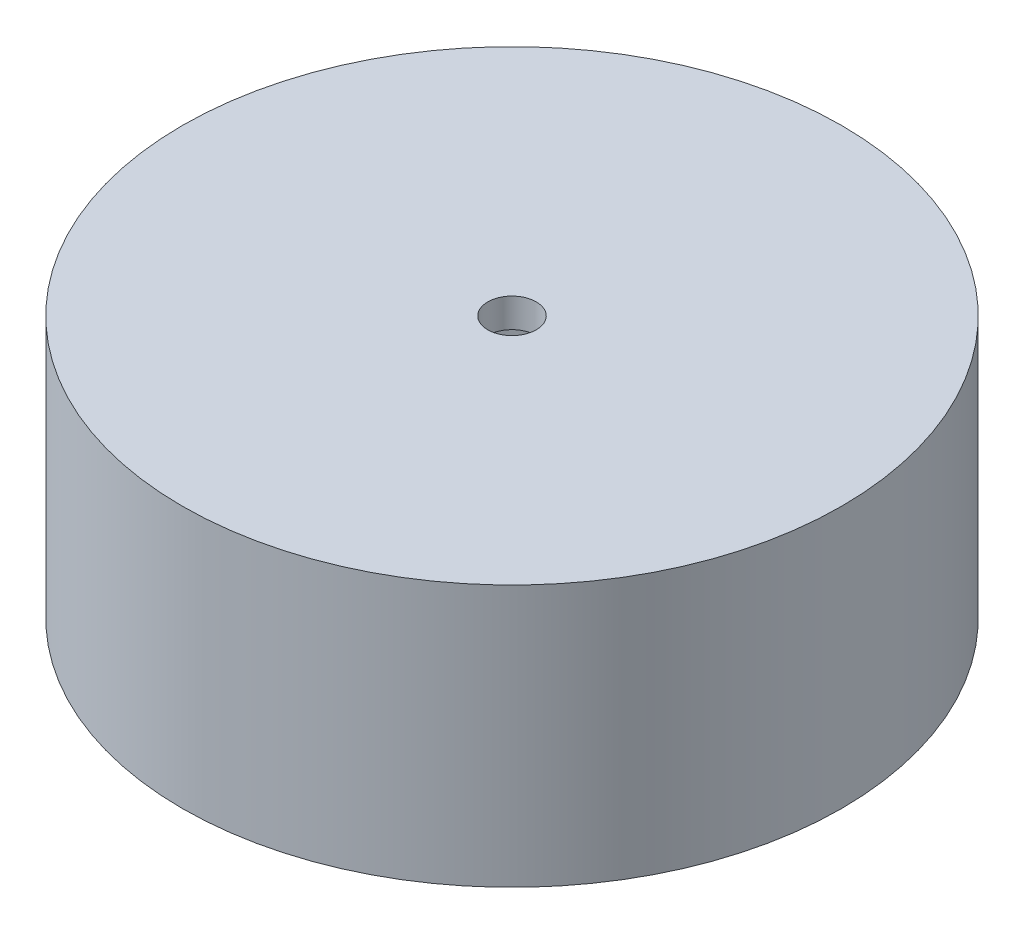
ISO-10303-21;
HEADER;
FILE_DESCRIPTION(('STEP AP214'),'2;1');
FILE_NAME('part.step','',(''),(''),'','','');
FILE_SCHEMA(('AUTOMOTIVE_DESIGN { 1 0 10303 214 1 1 1 1 }'));
ENDSEC;
DATA;
#1=APPLICATION_CONTEXT('core data for automotive mechanical design processes');
#2=APPLICATION_PROTOCOL_DEFINITION('international standard','automotive_design',2000,#1);
#3=PRODUCT_CONTEXT('',#1,'mechanical');
#4=PRODUCT('Part','Part','',(#3));
#5=PRODUCT_RELATED_PRODUCT_CATEGORY('part','',(#4));
#6=PRODUCT_DEFINITION_FORMATION('','',#4);
#7=PRODUCT_DEFINITION_CONTEXT('part definition',#1,'design');
#8=PRODUCT_DEFINITION('design','',#6,#7);
#9=PRODUCT_DEFINITION_SHAPE('','',#8);
#10=(LENGTH_UNIT() NAMED_UNIT(*) SI_UNIT(.MILLI.,.METRE.));
#11=(NAMED_UNIT(*) PLANE_ANGLE_UNIT() SI_UNIT($,.RADIAN.));
#12=(NAMED_UNIT(*) SI_UNIT($,.STERADIAN.) SOLID_ANGLE_UNIT());
#13=UNCERTAINTY_MEASURE_WITH_UNIT(LENGTH_MEASURE(1.E-05),#10,'distance_accuracy_value','');
#14=(GEOMETRIC_REPRESENTATION_CONTEXT(3) GLOBAL_UNCERTAINTY_ASSIGNED_CONTEXT((#13)) GLOBAL_UNIT_ASSIGNED_CONTEXT((#10,
#11,#12)) REPRESENTATION_CONTEXT('',''));
#15=CARTESIAN_POINT('',(0.,0.,0.));
#16=DIRECTION('',(0.,0.,1.));
#17=DIRECTION('',(1.,0.,0.));
#18=AXIS2_PLACEMENT_3D('',#15,#16,#17);
#19=CARTESIAN_POINT('',(0.,0.,0.));
#20=DIRECTION('',(0.,1.,0.));
#21=DIRECTION('',(0.,0.,1.));
#22=AXIS2_PLACEMENT_3D('',#19,#20,#21);
#23=PLANE('',#22);
#24=CARTESIAN_POINT('',(0.,0.,0.));
#25=DIRECTION('',(0.,1.,0.));
#26=DIRECTION('',(0.,0.,1.));
#27=AXIS2_PLACEMENT_3D('',#24,#25,#26);
#28=CIRCLE('',#27,7.5);
#29=CARTESIAN_POINT('',(0.,0.,7.5));
#30=VERTEX_POINT('',#29);
#31=EDGE_CURVE('E48',#30,#30,#28,.T.);
#32=ORIENTED_EDGE('',*,*,#31,.T.);
#33=EDGE_LOOP('',(#32));
#34=FACE_BOUND('',#33,.T.);
#35=CARTESIAN_POINT('',(0.,0.,0.));
#36=DIRECTION('',(0.,1.,0.));
#37=DIRECTION('',(0.,0.,1.));
#38=AXIS2_PLACEMENT_3D('',#35,#36,#37);
#39=CIRCLE('',#38,8.5);
#40=CARTESIAN_POINT('',(0.,0.,8.5));
#41=VERTEX_POINT('',#40);
#42=EDGE_CURVE('E55',#41,#41,#39,.T.);
#43=ORIENTED_EDGE('',*,*,#42,.F.);
#44=EDGE_LOOP('',(#43));
#45=FACE_BOUND('',#44,.T.);
#46=ADVANCED_FACE('F41',(#34,#45),#23,.F.);
#47=CARTESIAN_POINT('',(0.,6.,0.));
#48=DIRECTION('',(0.,-1.,0.));
#49=DIRECTION('',(0.,0.,-1.));
#50=AXIS2_PLACEMENT_3D('',#47,#48,#49);
#51=CYLINDRICAL_SURFACE('',#50,8.5);
#52=ORIENTED_EDGE('',*,*,#42,.T.);
#53=EDGE_LOOP('',(#52));
#54=FACE_BOUND('',#53,.T.);
#55=CARTESIAN_POINT('',(0.,6.75,0.));
#56=DIRECTION('',(0.,1.,0.));
#57=DIRECTION('',(0.,0.,1.));
#58=AXIS2_PLACEMENT_3D('',#55,#56,#57);
#59=CIRCLE('',#58,8.5);
#60=CARTESIAN_POINT('',(0.,6.75,8.5));
#61=VERTEX_POINT('',#60);
#62=EDGE_CURVE('E92',#61,#61,#59,.T.);
#63=ORIENTED_EDGE('',*,*,#62,.F.);
#64=EDGE_LOOP('',(#63));
#65=FACE_BOUND('',#64,.T.);
#66=ADVANCED_FACE('F84',(#54,#65),#51,.T.);
#67=CARTESIAN_POINT('',(0.,6.,0.));
#68=DIRECTION('',(0.,-1.,0.));
#69=DIRECTION('',(0.,0.,-1.));
#70=AXIS2_PLACEMENT_3D('',#67,#68,#69);
#71=CYLINDRICAL_SURFACE('',#70,7.);
#72=CARTESIAN_POINT('',(0.,0.5,0.));
#73=DIRECTION('',(0.,1.,0.));
#74=DIRECTION('',(0.,0.,1.));
#75=AXIS2_PLACEMENT_3D('',#72,#73,#74);
#76=CIRCLE('',#75,7.);
#77=CARTESIAN_POINT('',(0.,0.5,7.));
#78=VERTEX_POINT('',#77);
#79=EDGE_CURVE('E10',#78,#78,#76,.F.);
#80=ORIENTED_EDGE('',*,*,#79,.T.);
#81=EDGE_LOOP('',(#80));
#82=FACE_BOUND('',#81,.T.);
#83=CARTESIAN_POINT('',(0.,6.,0.));
#84=DIRECTION('',(0.,1.,0.));
#85=DIRECTION('',(0.,0.,1.));
#86=AXIS2_PLACEMENT_3D('',#83,#84,#85);
#87=CIRCLE('',#86,7.);
#88=CARTESIAN_POINT('',(0.,6.,7.));
#89=VERTEX_POINT('',#88);
#90=EDGE_CURVE('E57',#89,#89,#87,.T.);
#91=ORIENTED_EDGE('',*,*,#90,.T.);
#92=EDGE_LOOP('',(#91));
#93=FACE_BOUND('',#92,.T.);
#94=ADVANCED_FACE('F81',(#82,#93),#71,.F.);
#95=CARTESIAN_POINT('',(0.,6.,0.));
#96=DIRECTION('',(0.,1.,0.));
#97=DIRECTION('',(0.,0.,1.));
#98=AXIS2_PLACEMENT_3D('',#95,#96,#97);
#99=PLANE('',#98);
#100=CARTESIAN_POINT('',(0.,6.,0.));
#101=DIRECTION('',(0.,1.,0.));
#102=DIRECTION('',(0.,0.,1.));
#103=AXIS2_PLACEMENT_3D('',#100,#101,#102);
#104=CIRCLE('',#103,0.625);
#105=CARTESIAN_POINT('',(0.,6.,0.625));
#106=VERTEX_POINT('',#105);
#107=EDGE_CURVE('E100',#106,#106,#104,.T.);
#108=ORIENTED_EDGE('',*,*,#107,.T.);
#109=EDGE_LOOP('',(#108));
#110=FACE_BOUND('',#109,.T.);
#111=ORIENTED_EDGE('',*,*,#90,.F.);
#112=EDGE_LOOP('',(#111));
#113=FACE_BOUND('',#112,.T.);
#114=ADVANCED_FACE('F78',(#110,#113),#99,.F.);
#115=CARTESIAN_POINT('',(0.,6.75,0.));
#116=DIRECTION('',(0.,1.,0.));
#117=DIRECTION('',(0.,0.,1.));
#118=AXIS2_PLACEMENT_3D('',#115,#116,#117);
#119=PLANE('',#118);
#120=CARTESIAN_POINT('',(0.,6.750012,0.));
#121=DIRECTION('',(0.,1.,0.));
#122=DIRECTION('',(0.,0.,1.));
#123=AXIS2_PLACEMENT_3D('',#120,#121,#122);
#124=CIRCLE('',#123,0.625);
#125=CARTESIAN_POINT('',(0.,6.750012,0.625));
#126=VERTEX_POINT('',#125);
#127=EDGE_CURVE('E105',#126,#126,#124,.T.);
#128=ORIENTED_EDGE('',*,*,#127,.F.);
#129=EDGE_LOOP('',(#128));
#130=FACE_BOUND('',#129,.T.);
#131=ORIENTED_EDGE('',*,*,#62,.T.);
#132=EDGE_LOOP('',(#131));
#133=FACE_BOUND('',#132,.T.);
#134=ADVANCED_FACE('F61',(#130,#133),#119,.T.);
#135=CARTESIAN_POINT('',(0.,0.,0.));
#136=DIRECTION('',(0.,1.,0.));
#137=DIRECTION('',(0.,0.,1.));
#138=AXIS2_PLACEMENT_3D('',#135,#136,#137);
#139=CYLINDRICAL_SURFACE('',#138,0.625);
#140=ORIENTED_EDGE('',*,*,#127,.T.);
#141=EDGE_LOOP('',(#140));
#142=FACE_BOUND('',#141,.T.);
#143=ORIENTED_EDGE('',*,*,#107,.F.);
#144=EDGE_LOOP('',(#143));
#145=FACE_BOUND('',#144,.T.);
#146=ADVANCED_FACE('F73',(#142,#145),#139,.F.);
#147=CARTESIAN_POINT('',(0.,0.5,0.));
#148=DIRECTION('',(0.,1.,0.));
#149=DIRECTION('',(0.,0.,1.));
#150=AXIS2_PLACEMENT_3D('',#147,#148,#149);
#151=TOROIDAL_SURFACE('',#150,7.5,0.5);
#152=ORIENTED_EDGE('',*,*,#79,.F.);
#153=EDGE_LOOP('',(#152));
#154=FACE_BOUND('',#153,.T.);
#155=ORIENTED_EDGE('',*,*,#31,.F.);
#156=EDGE_LOOP('',(#155));
#157=FACE_BOUND('',#156,.T.);
#158=ADVANCED_FACE('F43',(#154,#157),#151,.T.);
#159=CLOSED_SHELL('',(#46,#66,#94,#114,#134,#146,#158));
#160=MANIFOLD_SOLID_BREP('B2',#159);
#161=ADVANCED_BREP_SHAPE_REPRESENTATION('',(#18,#160),#14);
#162=SHAPE_DEFINITION_REPRESENTATION(#9,#161);
ENDSEC;
END-ISO-10303-21;
